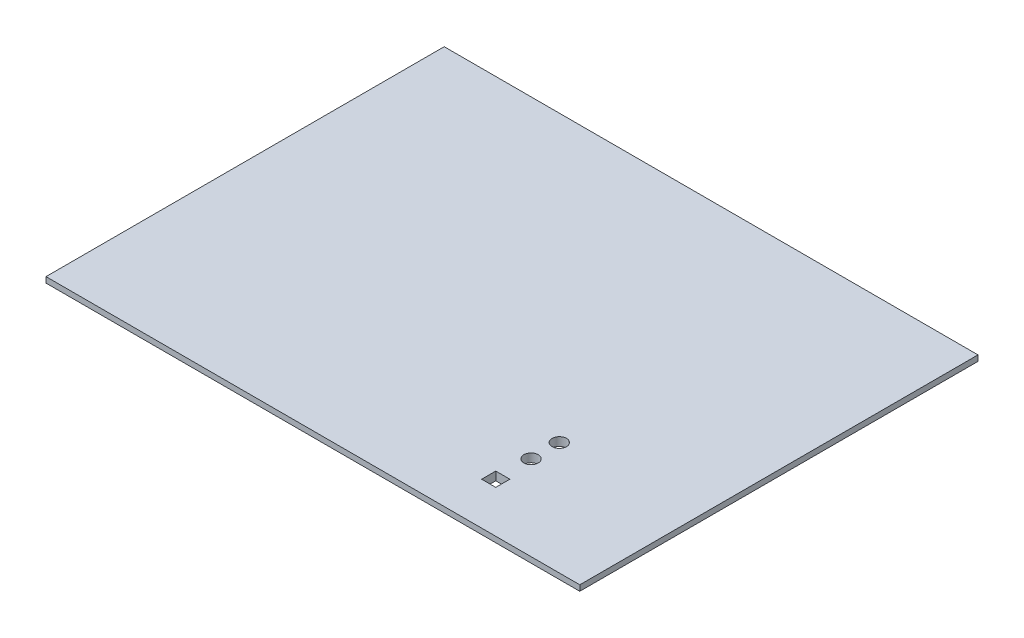
ISO-10303-21;
HEADER;
FILE_DESCRIPTION(('STEP AP214'),'2;1');
FILE_NAME('part.step','',(''),(''),'','','');
FILE_SCHEMA(('AUTOMOTIVE_DESIGN { 1 0 10303 214 1 1 1 1 }'));
ENDSEC;
DATA;
#1=APPLICATION_CONTEXT('core data for automotive mechanical design processes');
#2=APPLICATION_PROTOCOL_DEFINITION('international standard','automotive_design',2000,#1);
#3=PRODUCT_CONTEXT('',#1,'mechanical');
#4=PRODUCT('Part','Part','',(#3));
#5=PRODUCT_RELATED_PRODUCT_CATEGORY('part','',(#4));
#6=PRODUCT_DEFINITION_FORMATION('','',#4);
#7=PRODUCT_DEFINITION_CONTEXT('part definition',#1,'design');
#8=PRODUCT_DEFINITION('design','',#6,#7);
#9=PRODUCT_DEFINITION_SHAPE('','',#8);
#10=(LENGTH_UNIT() NAMED_UNIT(*) SI_UNIT(.MILLI.,.METRE.));
#11=(NAMED_UNIT(*) PLANE_ANGLE_UNIT() SI_UNIT($,.RADIAN.));
#12=(NAMED_UNIT(*) SI_UNIT($,.STERADIAN.) SOLID_ANGLE_UNIT());
#13=UNCERTAINTY_MEASURE_WITH_UNIT(LENGTH_MEASURE(1.E-05),#10,'distance_accuracy_value','');
#14=(GEOMETRIC_REPRESENTATION_CONTEXT(3) GLOBAL_UNCERTAINTY_ASSIGNED_CONTEXT((#13)) GLOBAL_UNIT_ASSIGNED_CONTEXT((#10,
#11,#12)) REPRESENTATION_CONTEXT('',''));
#15=CARTESIAN_POINT('',(0.,0.,0.));
#16=DIRECTION('',(0.,0.,1.));
#17=DIRECTION('',(1.,0.,0.));
#18=AXIS2_PLACEMENT_3D('',#15,#16,#17);
#19=CARTESIAN_POINT('',(89.95,1.,65.95));
#20=DIRECTION('',(-1.,0.,0.));
#21=DIRECTION('',(0.,0.,1.));
#22=AXIS2_PLACEMENT_3D('',#19,#20,#21);
#23=PLANE('',#22);
#24=DIRECTION('',(0.,0.,-1.));
#25=VECTOR('',#24,1.);
#26=CARTESIAN_POINT('',(89.95,0.,65.95));
#27=LINE('',#26,#25);
#28=CARTESIAN_POINT('',(89.95,0.,65.95));
#29=VERTEX_POINT('',#28);
#30=CARTESIAN_POINT('',(89.95,0.,-65.95));
#31=VERTEX_POINT('',#30);
#32=EDGE_CURVE('E200',#29,#31,#27,.T.);
#33=ORIENTED_EDGE('',*,*,#32,.T.);
#34=DIRECTION('',(0.,-1.,0.));
#35=VECTOR('',#34,1.);
#36=CARTESIAN_POINT('',(89.95,1.,-65.95));
#37=LINE('',#36,#35);
#38=CARTESIAN_POINT('',(89.95,1.,-65.95));
#39=VERTEX_POINT('',#38);
#40=EDGE_CURVE('E11',#39,#31,#37,.T.);
#41=ORIENTED_EDGE('',*,*,#40,.F.);
#42=DIRECTION('',(0.,0.,-1.));
#43=VECTOR('',#42,1.);
#44=CARTESIAN_POINT('',(89.95,1.,65.95));
#45=LINE('',#44,#43);
#46=CARTESIAN_POINT('',(89.95,1.,65.95));
#47=VERTEX_POINT('',#46);
#48=EDGE_CURVE('E201',#47,#39,#45,.T.);
#49=ORIENTED_EDGE('',*,*,#48,.F.);
#50=DIRECTION('',(0.,-1.,0.));
#51=VECTOR('',#50,1.);
#52=CARTESIAN_POINT('',(89.95,1.,65.95));
#53=LINE('',#52,#51);
#54=EDGE_CURVE('E214',#47,#29,#53,.T.);
#55=ORIENTED_EDGE('',*,*,#54,.T.);
#56=EDGE_LOOP('',(#33,#41,#49,#55));
#57=FACE_BOUND('',#56,.T.);
#58=ADVANCED_FACE('F39',(#57),#23,.F.);
#59=CARTESIAN_POINT('',(-89.95,1.,-65.95));
#60=DIRECTION('',(0.,0.,1.));
#61=DIRECTION('',(1.,0.,0.));
#62=AXIS2_PLACEMENT_3D('',#59,#60,#61);
#63=PLANE('',#62);
#64=DIRECTION('',(-1.,0.,0.));
#65=VECTOR('',#64,1.);
#66=CARTESIAN_POINT('',(-89.95,0.,-65.95));
#67=LINE('',#66,#65);
#68=CARTESIAN_POINT('',(-89.95,0.,-65.95));
#69=VERTEX_POINT('',#68);
#70=EDGE_CURVE('E217',#31,#69,#67,.T.);
#71=ORIENTED_EDGE('',*,*,#70,.T.);
#72=DIRECTION('',(0.,-1.,0.));
#73=VECTOR('',#72,1.);
#74=CARTESIAN_POINT('',(-89.95,1.,-65.95));
#75=LINE('',#74,#73);
#76=CARTESIAN_POINT('',(-89.95,1.,-65.95));
#77=VERTEX_POINT('',#76);
#78=EDGE_CURVE('E46',#77,#69,#75,.T.);
#79=ORIENTED_EDGE('',*,*,#78,.F.);
#80=DIRECTION('',(-1.,0.,0.));
#81=VECTOR('',#80,1.);
#82=CARTESIAN_POINT('',(-89.95,1.,-65.95));
#83=LINE('',#82,#81);
#84=EDGE_CURVE('E204',#39,#77,#83,.T.);
#85=ORIENTED_EDGE('',*,*,#84,.F.);
#86=ORIENTED_EDGE('',*,*,#40,.T.);
#87=EDGE_LOOP('',(#71,#79,#85,#86));
#88=FACE_BOUND('',#87,.T.);
#89=ADVANCED_FACE('F245',(#88),#63,.F.);
#90=CARTESIAN_POINT('',(-89.95,1.,65.95));
#91=DIRECTION('',(1.,0.,0.));
#92=DIRECTION('',(0.,0.,-1.));
#93=AXIS2_PLACEMENT_3D('',#90,#91,#92);
#94=PLANE('',#93);
#95=DIRECTION('',(0.,0.,1.));
#96=VECTOR('',#95,1.);
#97=CARTESIAN_POINT('',(-89.95,0.,65.95));
#98=LINE('',#97,#96);
#99=CARTESIAN_POINT('',(-89.95,0.,65.95));
#100=VERTEX_POINT('',#99);
#101=EDGE_CURVE('E219',#69,#100,#98,.T.);
#102=ORIENTED_EDGE('',*,*,#101,.T.);
#103=DIRECTION('',(0.,-1.,0.));
#104=VECTOR('',#103,1.);
#105=CARTESIAN_POINT('',(-89.95,1.,65.95));
#106=LINE('',#105,#104);
#107=CARTESIAN_POINT('',(-89.95,1.,65.95));
#108=VERTEX_POINT('',#107);
#109=EDGE_CURVE('E224',#108,#100,#106,.T.);
#110=ORIENTED_EDGE('',*,*,#109,.F.);
#111=DIRECTION('',(0.,0.,1.));
#112=VECTOR('',#111,1.);
#113=CARTESIAN_POINT('',(-89.95,1.,65.95));
#114=LINE('',#113,#112);
#115=EDGE_CURVE('E208',#77,#108,#114,.T.);
#116=ORIENTED_EDGE('',*,*,#115,.F.);
#117=ORIENTED_EDGE('',*,*,#78,.T.);
#118=EDGE_LOOP('',(#102,#110,#116,#117));
#119=FACE_BOUND('',#118,.T.);
#120=ADVANCED_FACE('F230',(#119),#94,.F.);
#121=CARTESIAN_POINT('',(-89.95,1.,65.95));
#122=DIRECTION('',(0.,0.,-1.));
#123=DIRECTION('',(-1.,0.,0.));
#124=AXIS2_PLACEMENT_3D('',#121,#122,#123);
#125=PLANE('',#124);
#126=DIRECTION('',(1.,0.,0.));
#127=VECTOR('',#126,1.);
#128=CARTESIAN_POINT('',(-89.95,0.,65.95));
#129=LINE('',#128,#127);
#130=EDGE_CURVE('E205',#100,#29,#129,.T.);
#131=ORIENTED_EDGE('',*,*,#130,.T.);
#132=ORIENTED_EDGE('',*,*,#54,.F.);
#133=DIRECTION('',(1.,0.,0.));
#134=VECTOR('',#133,1.);
#135=CARTESIAN_POINT('',(-89.95,1.,65.95));
#136=LINE('',#135,#134);
#137=EDGE_CURVE('E211',#108,#47,#136,.T.);
#138=ORIENTED_EDGE('',*,*,#137,.F.);
#139=ORIENTED_EDGE('',*,*,#109,.T.);
#140=EDGE_LOOP('',(#131,#132,#138,#139));
#141=FACE_BOUND('',#140,.T.);
#142=ADVANCED_FACE('F238',(#141),#125,.F.);
#143=CARTESIAN_POINT('',(0.,0.,0.));
#144=DIRECTION('',(0.,-1.,0.));
#145=DIRECTION('',(0.,0.,-1.));
#146=AXIS2_PLACEMENT_3D('',#143,#144,#145);
#147=PLANE('',#146);
#148=DIRECTION('',(0.,0.,-1.));
#149=VECTOR('',#148,1.);
#150=CARTESIAN_POINT('',(49.75,0.,55.5));
#151=LINE('',#150,#149);
#152=CARTESIAN_POINT('',(49.75,0.,55.5));
#153=VERTEX_POINT('',#152);
#154=CARTESIAN_POINT('',(49.75,0.,50.5));
#155=VERTEX_POINT('',#154);
#156=EDGE_CURVE('E129',#153,#155,#151,.T.);
#157=ORIENTED_EDGE('',*,*,#156,.T.);
#158=DIRECTION('',(-1.,0.,0.));
#159=VECTOR('',#158,1.);
#160=CARTESIAN_POINT('',(44.75,0.,50.5));
#161=LINE('',#160,#159);
#162=CARTESIAN_POINT('',(44.75,0.,50.5));
#163=VERTEX_POINT('',#162);
#164=EDGE_CURVE('E160',#155,#163,#161,.T.);
#165=ORIENTED_EDGE('',*,*,#164,.T.);
#166=DIRECTION('',(0.,0.,1.));
#167=VECTOR('',#166,1.);
#168=CARTESIAN_POINT('',(44.75,0.,55.5));
#169=LINE('',#168,#167);
#170=CARTESIAN_POINT('',(44.75,0.,55.5));
#171=VERTEX_POINT('',#170);
#172=EDGE_CURVE('E53',#163,#171,#169,.T.);
#173=ORIENTED_EDGE('',*,*,#172,.T.);
#174=DIRECTION('',(1.,0.,0.));
#175=VECTOR('',#174,1.);
#176=CARTESIAN_POINT('',(44.75,0.,55.5));
#177=LINE('',#176,#175);
#178=EDGE_CURVE('E156',#171,#153,#177,.T.);
#179=ORIENTED_EDGE('',*,*,#178,.T.);
#180=EDGE_LOOP('',(#157,#165,#173,#179));
#181=FACE_BOUND('',#180,.T.);
#182=CARTESIAN_POINT('',(47.25,0.,30.5));
#183=DIRECTION('',(0.,1.,0.));
#184=DIRECTION('',(0.,0.,1.));
#185=AXIS2_PLACEMENT_3D('',#182,#183,#184);
#186=CIRCLE('',#185,2.54999999999999);
#187=CARTESIAN_POINT('',(47.25,0.,33.05));
#188=VERTEX_POINT('',#187);
#189=EDGE_CURVE('E148',#188,#188,#186,.T.);
#190=ORIENTED_EDGE('',*,*,#189,.T.);
#191=EDGE_LOOP('',(#190));
#192=FACE_BOUND('',#191,.T.);
#193=CARTESIAN_POINT('',(47.25,0.,40.5));
#194=DIRECTION('',(0.,1.,0.));
#195=DIRECTION('',(0.,0.,1.));
#196=AXIS2_PLACEMENT_3D('',#193,#194,#195);
#197=CIRCLE('',#196,2.54999999999999);
#198=CARTESIAN_POINT('',(47.25,0.,43.05));
#199=VERTEX_POINT('',#198);
#200=EDGE_CURVE('E164',#199,#199,#197,.T.);
#201=ORIENTED_EDGE('',*,*,#200,.T.);
#202=EDGE_LOOP('',(#201));
#203=FACE_BOUND('',#202,.T.);
#204=ORIENTED_EDGE('',*,*,#32,.F.);
#205=ORIENTED_EDGE('',*,*,#130,.F.);
#206=ORIENTED_EDGE('',*,*,#101,.F.);
#207=ORIENTED_EDGE('',*,*,#70,.F.);
#208=EDGE_LOOP('',(#204,#205,#206,#207));
#209=FACE_BOUND('',#208,.T.);
#210=ADVANCED_FACE('F235',(#181,#192,#203,#209),#147,.T.);
#211=CARTESIAN_POINT('',(94.5,3.,70.5));
#212=DIRECTION('',(-1.,0.,0.));
#213=DIRECTION('',(0.,0.,1.));
#214=AXIS2_PLACEMENT_3D('',#211,#212,#213);
#215=PLANE('',#214);
#216=DIRECTION('',(0.,0.,-1.));
#217=VECTOR('',#216,1.);
#218=CARTESIAN_POINT('',(94.5,1.,70.5));
#219=LINE('',#218,#217);
#220=CARTESIAN_POINT('',(94.5,1.,70.5));
#221=VERTEX_POINT('',#220);
#222=CARTESIAN_POINT('',(94.5,1.,-70.5));
#223=VERTEX_POINT('',#222);
#224=EDGE_CURVE('E167',#221,#223,#219,.T.);
#225=ORIENTED_EDGE('',*,*,#224,.T.);
#226=DIRECTION('',(0.,-1.,0.));
#227=VECTOR('',#226,1.);
#228=CARTESIAN_POINT('',(94.5,3.,-70.5));
#229=LINE('',#228,#227);
#230=CARTESIAN_POINT('',(94.5,3.,-70.5));
#231=VERTEX_POINT('',#230);
#232=EDGE_CURVE('E197',#231,#223,#229,.T.);
#233=ORIENTED_EDGE('',*,*,#232,.F.);
#234=DIRECTION('',(0.,0.,-1.));
#235=VECTOR('',#234,1.);
#236=CARTESIAN_POINT('',(94.5,3.,70.5));
#237=LINE('',#236,#235);
#238=CARTESIAN_POINT('',(94.5,3.,70.5));
#239=VERTEX_POINT('',#238);
#240=EDGE_CURVE('E171',#239,#231,#237,.T.);
#241=ORIENTED_EDGE('',*,*,#240,.F.);
#242=DIRECTION('',(0.,-1.,0.));
#243=VECTOR('',#242,1.);
#244=CARTESIAN_POINT('',(94.5,3.,70.5));
#245=LINE('',#244,#243);
#246=EDGE_CURVE('E181',#239,#221,#245,.T.);
#247=ORIENTED_EDGE('',*,*,#246,.T.);
#248=EDGE_LOOP('',(#225,#233,#241,#247));
#249=FACE_BOUND('',#248,.T.);
#250=ADVANCED_FACE('F257',(#249),#215,.F.);
#251=CARTESIAN_POINT('',(-94.5,3.,-70.5));
#252=DIRECTION('',(0.,0.,1.));
#253=DIRECTION('',(1.,0.,0.));
#254=AXIS2_PLACEMENT_3D('',#251,#252,#253);
#255=PLANE('',#254);
#256=DIRECTION('',(-1.,0.,0.));
#257=VECTOR('',#256,1.);
#258=CARTESIAN_POINT('',(-94.5,1.,-70.5));
#259=LINE('',#258,#257);
#260=CARTESIAN_POINT('',(-94.5,1.,-70.5));
#261=VERTEX_POINT('',#260);
#262=EDGE_CURVE('E184',#223,#261,#259,.T.);
#263=ORIENTED_EDGE('',*,*,#262,.T.);
#264=DIRECTION('',(0.,-1.,0.));
#265=VECTOR('',#264,1.);
#266=CARTESIAN_POINT('',(-94.5,3.,-70.5));
#267=LINE('',#266,#265);
#268=CARTESIAN_POINT('',(-94.5,3.,-70.5));
#269=VERTEX_POINT('',#268);
#270=EDGE_CURVE('E194',#269,#261,#267,.T.);
#271=ORIENTED_EDGE('',*,*,#270,.F.);
#272=DIRECTION('',(-1.,0.,0.));
#273=VECTOR('',#272,1.);
#274=CARTESIAN_POINT('',(-94.5,3.,-70.5));
#275=LINE('',#274,#273);
#276=EDGE_CURVE('E174',#231,#269,#275,.T.);
#277=ORIENTED_EDGE('',*,*,#276,.F.);
#278=ORIENTED_EDGE('',*,*,#232,.T.);
#279=EDGE_LOOP('',(#263,#271,#277,#278));
#280=FACE_BOUND('',#279,.T.);
#281=ADVANCED_FACE('F261',(#280),#255,.F.);
#282=CARTESIAN_POINT('',(-94.5,3.,70.5));
#283=DIRECTION('',(1.,0.,0.));
#284=DIRECTION('',(0.,0.,-1.));
#285=AXIS2_PLACEMENT_3D('',#282,#283,#284);
#286=PLANE('',#285);
#287=DIRECTION('',(0.,0.,1.));
#288=VECTOR('',#287,1.);
#289=CARTESIAN_POINT('',(-94.5,1.,70.5));
#290=LINE('',#289,#288);
#291=CARTESIAN_POINT('',(-94.5,1.,70.5));
#292=VERTEX_POINT('',#291);
#293=EDGE_CURVE('E186',#261,#292,#290,.T.);
#294=ORIENTED_EDGE('',*,*,#293,.T.);
#295=DIRECTION('',(0.,-1.,0.));
#296=VECTOR('',#295,1.);
#297=CARTESIAN_POINT('',(-94.5,3.,70.5));
#298=LINE('',#297,#296);
#299=CARTESIAN_POINT('',(-94.5,3.,70.5));
#300=VERTEX_POINT('',#299);
#301=EDGE_CURVE('E191',#300,#292,#298,.T.);
#302=ORIENTED_EDGE('',*,*,#301,.F.);
#303=DIRECTION('',(0.,0.,1.));
#304=VECTOR('',#303,1.);
#305=CARTESIAN_POINT('',(-94.5,3.,70.5));
#306=LINE('',#305,#304);
#307=EDGE_CURVE('E177',#269,#300,#306,.T.);
#308=ORIENTED_EDGE('',*,*,#307,.F.);
#309=ORIENTED_EDGE('',*,*,#270,.T.);
#310=EDGE_LOOP('',(#294,#302,#308,#309));
#311=FACE_BOUND('',#310,.T.);
#312=ADVANCED_FACE('F265',(#311),#286,.F.);
#313=CARTESIAN_POINT('',(-94.5,3.,70.5));
#314=DIRECTION('',(0.,0.,-1.));
#315=DIRECTION('',(-1.,0.,0.));
#316=AXIS2_PLACEMENT_3D('',#313,#314,#315);
#317=PLANE('',#316);
#318=DIRECTION('',(1.,0.,0.));
#319=VECTOR('',#318,1.);
#320=CARTESIAN_POINT('',(-94.5,1.,70.5));
#321=LINE('',#320,#319);
#322=EDGE_CURVE('E175',#292,#221,#321,.T.);
#323=ORIENTED_EDGE('',*,*,#322,.T.);
#324=ORIENTED_EDGE('',*,*,#246,.F.);
#325=DIRECTION('',(1.,0.,0.));
#326=VECTOR('',#325,1.);
#327=CARTESIAN_POINT('',(-94.5,3.,70.5));
#328=LINE('',#327,#326);
#329=EDGE_CURVE('E179',#300,#239,#328,.T.);
#330=ORIENTED_EDGE('',*,*,#329,.F.);
#331=ORIENTED_EDGE('',*,*,#301,.T.);
#332=EDGE_LOOP('',(#323,#324,#330,#331));
#333=FACE_BOUND('',#332,.T.);
#334=ADVANCED_FACE('F269',(#333),#317,.F.);
#335=CARTESIAN_POINT('',(0.,3.,0.));
#336=DIRECTION('',(0.,-1.,0.));
#337=DIRECTION('',(0.,0.,-1.));
#338=AXIS2_PLACEMENT_3D('',#335,#336,#337);
#339=PLANE('',#338);
#340=DIRECTION('',(-1.,0.,0.));
#341=VECTOR('',#340,1.);
#342=CARTESIAN_POINT('',(44.75,3.,50.5));
#343=LINE('',#342,#341);
#344=CARTESIAN_POINT('',(49.75,3.,50.5));
#345=VERTEX_POINT('',#344);
#346=CARTESIAN_POINT('',(44.75,3.,50.5));
#347=VERTEX_POINT('',#346);
#348=EDGE_CURVE('E147',#345,#347,#343,.T.);
#349=ORIENTED_EDGE('',*,*,#348,.F.);
#350=DIRECTION('',(0.,0.,-1.));
#351=VECTOR('',#350,1.);
#352=CARTESIAN_POINT('',(49.75,3.,55.5));
#353=LINE('',#352,#351);
#354=CARTESIAN_POINT('',(49.75,3.,55.5));
#355=VERTEX_POINT('',#354);
#356=EDGE_CURVE('E61',#355,#345,#353,.T.);
#357=ORIENTED_EDGE('',*,*,#356,.F.);
#358=DIRECTION('',(1.,0.,0.));
#359=VECTOR('',#358,1.);
#360=CARTESIAN_POINT('',(44.75,3.,55.5));
#361=LINE('',#360,#359);
#362=CARTESIAN_POINT('',(44.75,3.,55.5));
#363=VERTEX_POINT('',#362);
#364=EDGE_CURVE('E136',#363,#355,#361,.T.);
#365=ORIENTED_EDGE('',*,*,#364,.F.);
#366=DIRECTION('',(0.,0.,1.));
#367=VECTOR('',#366,1.);
#368=CARTESIAN_POINT('',(44.75,3.,55.5));
#369=LINE('',#368,#367);
#370=EDGE_CURVE('E141',#347,#363,#369,.T.);
#371=ORIENTED_EDGE('',*,*,#370,.F.);
#372=EDGE_LOOP('',(#349,#357,#365,#371));
#373=FACE_BOUND('',#372,.T.);
#374=CARTESIAN_POINT('',(47.25,3.,30.5));
#375=DIRECTION('',(0.,1.,0.));
#376=DIRECTION('',(0.,0.,1.));
#377=AXIS2_PLACEMENT_3D('',#374,#375,#376);
#378=CIRCLE('',#377,2.54999999999999);
#379=CARTESIAN_POINT('',(47.25,3.,33.05));
#380=VERTEX_POINT('',#379);
#381=EDGE_CURVE('E151',#380,#380,#378,.T.);
#382=ORIENTED_EDGE('',*,*,#381,.F.);
#383=EDGE_LOOP('',(#382));
#384=FACE_BOUND('',#383,.T.);
#385=CARTESIAN_POINT('',(47.25,3.,40.5));
#386=DIRECTION('',(0.,1.,0.));
#387=DIRECTION('',(0.,0.,1.));
#388=AXIS2_PLACEMENT_3D('',#385,#386,#387);
#389=CIRCLE('',#388,2.54999999999999);
#390=CARTESIAN_POINT('',(47.25,3.,43.05));
#391=VERTEX_POINT('',#390);
#392=EDGE_CURVE('E168',#391,#391,#389,.T.);
#393=ORIENTED_EDGE('',*,*,#392,.F.);
#394=EDGE_LOOP('',(#393));
#395=FACE_BOUND('',#394,.T.);
#396=ORIENTED_EDGE('',*,*,#240,.T.);
#397=ORIENTED_EDGE('',*,*,#276,.T.);
#398=ORIENTED_EDGE('',*,*,#307,.T.);
#399=ORIENTED_EDGE('',*,*,#329,.T.);
#400=EDGE_LOOP('',(#396,#397,#398,#399));
#401=FACE_BOUND('',#400,.T.);
#402=ADVANCED_FACE('F144',(#373,#384,#395,#401),#339,.F.);
#403=CARTESIAN_POINT('',(0.,1.,0.));
#404=DIRECTION('',(0.,-1.,0.));
#405=DIRECTION('',(0.,0.,-1.));
#406=AXIS2_PLACEMENT_3D('',#403,#404,#405);
#407=PLANE('',#406);
#408=ORIENTED_EDGE('',*,*,#137,.T.);
#409=ORIENTED_EDGE('',*,*,#48,.T.);
#410=ORIENTED_EDGE('',*,*,#84,.T.);
#411=ORIENTED_EDGE('',*,*,#115,.T.);
#412=EDGE_LOOP('',(#408,#409,#410,#411));
#413=FACE_BOUND('',#412,.T.);
#414=ORIENTED_EDGE('',*,*,#224,.F.);
#415=ORIENTED_EDGE('',*,*,#322,.F.);
#416=ORIENTED_EDGE('',*,*,#293,.F.);
#417=ORIENTED_EDGE('',*,*,#262,.F.);
#418=EDGE_LOOP('',(#414,#415,#416,#417));
#419=FACE_BOUND('',#418,.T.);
#420=ADVANCED_FACE('F243',(#413,#419),#407,.T.);
#421=CARTESIAN_POINT('',(47.25,0.,40.5));
#422=DIRECTION('',(0.,1.,0.));
#423=DIRECTION('',(0.,0.,1.));
#424=AXIS2_PLACEMENT_3D('',#421,#422,#423);
#425=CYLINDRICAL_SURFACE('',#424,2.54999999999999);
#426=ORIENTED_EDGE('',*,*,#200,.F.);
#427=EDGE_LOOP('',(#426));
#428=FACE_BOUND('',#427,.T.);
#429=ORIENTED_EDGE('',*,*,#392,.T.);
#430=EDGE_LOOP('',(#429));
#431=FACE_BOUND('',#430,.T.);
#432=ADVANCED_FACE('F276',(#428,#431),#425,.F.);
#433=CARTESIAN_POINT('',(47.25,0.,30.5));
#434=DIRECTION('',(0.,1.,0.));
#435=DIRECTION('',(0.,0.,1.));
#436=AXIS2_PLACEMENT_3D('',#433,#434,#435);
#437=CYLINDRICAL_SURFACE('',#436,2.54999999999999);
#438=ORIENTED_EDGE('',*,*,#189,.F.);
#439=EDGE_LOOP('',(#438));
#440=FACE_BOUND('',#439,.T.);
#441=ORIENTED_EDGE('',*,*,#381,.T.);
#442=EDGE_LOOP('',(#441));
#443=FACE_BOUND('',#442,.T.);
#444=ADVANCED_FACE('F281',(#440,#443),#437,.F.);
#445=CARTESIAN_POINT('',(49.75,0.,55.5));
#446=DIRECTION('',(1.,0.,0.));
#447=DIRECTION('',(0.,0.,-1.));
#448=AXIS2_PLACEMENT_3D('',#445,#446,#447);
#449=PLANE('',#448);
#450=ORIENTED_EDGE('',*,*,#356,.T.);
#451=DIRECTION('',(0.,1.,0.));
#452=VECTOR('',#451,1.);
#453=CARTESIAN_POINT('',(49.75,0.,50.5));
#454=LINE('',#453,#452);
#455=EDGE_CURVE('E158',#155,#345,#454,.T.);
#456=ORIENTED_EDGE('',*,*,#455,.F.);
#457=ORIENTED_EDGE('',*,*,#156,.F.);
#458=DIRECTION('',(0.,1.,0.));
#459=VECTOR('',#458,1.);
#460=CARTESIAN_POINT('',(49.75,0.,55.5));
#461=LINE('',#460,#459);
#462=EDGE_CURVE('E125',#153,#355,#461,.T.);
#463=ORIENTED_EDGE('',*,*,#462,.T.);
#464=EDGE_LOOP('',(#450,#456,#457,#463));
#465=FACE_BOUND('',#464,.T.);
#466=ADVANCED_FACE('F127',(#465),#449,.F.);
#467=CARTESIAN_POINT('',(44.75,0.,55.5));
#468=DIRECTION('',(0.,0.,1.));
#469=DIRECTION('',(1.,0.,0.));
#470=AXIS2_PLACEMENT_3D('',#467,#468,#469);
#471=PLANE('',#470);
#472=ORIENTED_EDGE('',*,*,#364,.T.);
#473=ORIENTED_EDGE('',*,*,#462,.F.);
#474=ORIENTED_EDGE('',*,*,#178,.F.);
#475=DIRECTION('',(0.,1.,0.));
#476=VECTOR('',#475,1.);
#477=CARTESIAN_POINT('',(44.75,0.,55.5));
#478=LINE('',#477,#476);
#479=EDGE_CURVE('E133',#171,#363,#478,.T.);
#480=ORIENTED_EDGE('',*,*,#479,.T.);
#481=EDGE_LOOP('',(#472,#473,#474,#480));
#482=FACE_BOUND('',#481,.T.);
#483=ADVANCED_FACE('F137',(#482),#471,.F.);
#484=CARTESIAN_POINT('',(44.75,0.,55.5));
#485=DIRECTION('',(-1.,0.,0.));
#486=DIRECTION('',(0.,0.,1.));
#487=AXIS2_PLACEMENT_3D('',#484,#485,#486);
#488=PLANE('',#487);
#489=ORIENTED_EDGE('',*,*,#370,.T.);
#490=ORIENTED_EDGE('',*,*,#479,.F.);
#491=ORIENTED_EDGE('',*,*,#172,.F.);
#492=DIRECTION('',(0.,1.,0.));
#493=VECTOR('',#492,1.);
#494=CARTESIAN_POINT('',(44.75,0.,50.5));
#495=LINE('',#494,#493);
#496=EDGE_CURVE('E305',#163,#347,#495,.T.);
#497=ORIENTED_EDGE('',*,*,#496,.T.);
#498=EDGE_LOOP('',(#489,#490,#491,#497));
#499=FACE_BOUND('',#498,.T.);
#500=ADVANCED_FACE('F285',(#499),#488,.F.);
#501=CARTESIAN_POINT('',(44.75,0.,50.5));
#502=DIRECTION('',(0.,0.,-1.));
#503=DIRECTION('',(-1.,0.,0.));
#504=AXIS2_PLACEMENT_3D('',#501,#502,#503);
#505=PLANE('',#504);
#506=ORIENTED_EDGE('',*,*,#348,.T.);
#507=ORIENTED_EDGE('',*,*,#496,.F.);
#508=ORIENTED_EDGE('',*,*,#164,.F.);
#509=ORIENTED_EDGE('',*,*,#455,.T.);
#510=EDGE_LOOP('',(#506,#507,#508,#509));
#511=FACE_BOUND('',#510,.T.);
#512=ADVANCED_FACE('F288',(#511),#505,.F.);
#513=CLOSED_SHELL('',(#58,#89,#120,#142,#210,#250,#281,#312,#334,#402,#420,#432,#444,#466,#483,
#500,#512));
#514=MANIFOLD_SOLID_BREP('B2',#513);
#515=ADVANCED_BREP_SHAPE_REPRESENTATION('',(#18,#514),#14);
#516=SHAPE_DEFINITION_REPRESENTATION(#9,#515);
ENDSEC;
END-ISO-10303-21;
